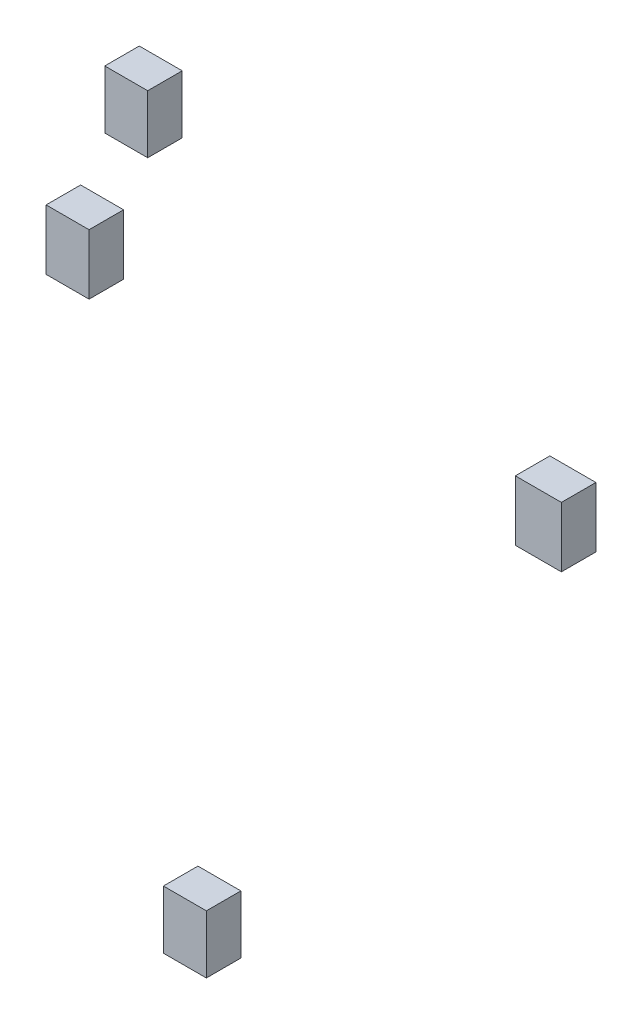
ISO-10303-21;
HEADER;
FILE_DESCRIPTION(('STEP AP214'),'2;1');
FILE_NAME('part.step','',(''),(''),'','','');
FILE_SCHEMA(('AUTOMOTIVE_DESIGN { 1 0 10303 214 1 1 1 1 }'));
ENDSEC;
DATA;
#1=APPLICATION_CONTEXT('core data for automotive mechanical design processes');
#2=APPLICATION_PROTOCOL_DEFINITION('international standard','automotive_design',2000,#1);
#3=PRODUCT_CONTEXT('',#1,'mechanical');
#4=PRODUCT('Part','Part','',(#3));
#5=PRODUCT_RELATED_PRODUCT_CATEGORY('part','',(#4));
#6=PRODUCT_DEFINITION_FORMATION('','',#4);
#7=PRODUCT_DEFINITION_CONTEXT('part definition',#1,'design');
#8=PRODUCT_DEFINITION('design','',#6,#7);
#9=PRODUCT_DEFINITION_SHAPE('','',#8);
#10=(LENGTH_UNIT() NAMED_UNIT(*) SI_UNIT(.MILLI.,.METRE.));
#11=(NAMED_UNIT(*) PLANE_ANGLE_UNIT() SI_UNIT($,.RADIAN.));
#12=(NAMED_UNIT(*) SI_UNIT($,.STERADIAN.) SOLID_ANGLE_UNIT());
#13=UNCERTAINTY_MEASURE_WITH_UNIT(LENGTH_MEASURE(1.E-05),#10,'distance_accuracy_value','');
#14=(GEOMETRIC_REPRESENTATION_CONTEXT(3) GLOBAL_UNCERTAINTY_ASSIGNED_CONTEXT((#13)) GLOBAL_UNIT_ASSIGNED_CONTEXT((#10,
#11,#12)) REPRESENTATION_CONTEXT('',''));
#15=CARTESIAN_POINT('',(0.,0.,0.));
#16=DIRECTION('',(0.,0.,1.));
#17=DIRECTION('',(1.,0.,0.));
#18=AXIS2_PLACEMENT_3D('',#15,#16,#17);
#19=CARTESIAN_POINT('',(-4.50549999999963,-65.4,7.25));
#20=DIRECTION('',(1.,0.,0.));
#21=DIRECTION('',(0.,1.,0.));
#22=AXIS2_PLACEMENT_3D('',#19,#20,#21);
#23=PLANE('',#22);
#24=DIRECTION('',(0.,-1.,0.));
#25=VECTOR('',#24,1.);
#26=CARTESIAN_POINT('',(-4.50549999999963,-65.4,0.));
#27=LINE('',#26,#25);
#28=CARTESIAN_POINT('',(-4.50549999999963,-65.4,0.));
#29=VERTEX_POINT('',#28);
#30=CARTESIAN_POINT('',(-4.50549999999963,-77.6214301256037,0.));
#31=VERTEX_POINT('',#30);
#32=EDGE_CURVE('E139',#29,#31,#27,.T.);
#33=ORIENTED_EDGE('',*,*,#32,.T.);
#34=DIRECTION('',(0.,0.,-1.));
#35=VECTOR('',#34,1.);
#36=CARTESIAN_POINT('',(-4.50549999999963,-77.6214301256037,7.25));
#37=LINE('',#36,#35);
#38=CARTESIAN_POINT('',(-4.50549999999963,-77.6214301256037,7.25));
#39=VERTEX_POINT('',#38);
#40=EDGE_CURVE('E12',#39,#31,#37,.T.);
#41=ORIENTED_EDGE('',*,*,#40,.F.);
#42=DIRECTION('',(0.,-1.,0.));
#43=VECTOR('',#42,1.);
#44=CARTESIAN_POINT('',(-4.50549999999963,-65.4,7.25));
#45=LINE('',#44,#43);
#46=CARTESIAN_POINT('',(-4.50549999999963,-65.4,7.25));
#47=VERTEX_POINT('',#46);
#48=EDGE_CURVE('E159',#47,#39,#45,.T.);
#49=ORIENTED_EDGE('',*,*,#48,.F.);
#50=DIRECTION('',(0.,0.,-1.));
#51=VECTOR('',#50,1.);
#52=CARTESIAN_POINT('',(-4.50549999999963,-65.4,7.25));
#53=LINE('',#52,#51);
#54=EDGE_CURVE('E164',#47,#29,#53,.T.);
#55=ORIENTED_EDGE('',*,*,#54,.T.);
#56=EDGE_LOOP('',(#33,#41,#49,#55));
#57=FACE_BOUND('',#56,.T.);
#58=ADVANCED_FACE('F43',(#57),#23,.F.);
#59=CARTESIAN_POINT('',(-4.50549999999963,-77.6214301256037,7.25));
#60=DIRECTION('',(0.,1.,0.));
#61=DIRECTION('',(0.,0.,1.));
#62=AXIS2_PLACEMENT_3D('',#59,#60,#61);
#63=PLANE('',#62);
#64=DIRECTION('',(1.,0.,0.));
#65=VECTOR('',#64,1.);
#66=CARTESIAN_POINT('',(-4.50549999999963,-77.6214301256037,0.));
#67=LINE('',#66,#65);
#68=CARTESIAN_POINT('',(4.51450000000038,-77.6214301256037,0.));
#69=VERTEX_POINT('',#68);
#70=EDGE_CURVE('E143',#31,#69,#67,.T.);
#71=ORIENTED_EDGE('',*,*,#70,.T.);
#72=DIRECTION('',(0.,0.,-1.));
#73=VECTOR('',#72,1.);
#74=CARTESIAN_POINT('',(4.51450000000038,-77.6214301256037,7.25));
#75=LINE('',#74,#73);
#76=CARTESIAN_POINT('',(4.51450000000038,-77.6214301256037,7.25));
#77=VERTEX_POINT('',#76);
#78=EDGE_CURVE('E50',#77,#69,#75,.T.);
#79=ORIENTED_EDGE('',*,*,#78,.F.);
#80=DIRECTION('',(1.,0.,0.));
#81=VECTOR('',#80,1.);
#82=CARTESIAN_POINT('',(-4.50549999999963,-77.6214301256037,7.25));
#83=LINE('',#82,#81);
#84=EDGE_CURVE('E94',#39,#77,#83,.T.);
#85=ORIENTED_EDGE('',*,*,#84,.F.);
#86=ORIENTED_EDGE('',*,*,#40,.T.);
#87=EDGE_LOOP('',(#71,#79,#85,#86));
#88=FACE_BOUND('',#87,.T.);
#89=ADVANCED_FACE('F193',(#88),#63,.F.);
#90=CARTESIAN_POINT('',(4.51450000000038,-65.4,7.25));
#91=DIRECTION('',(-1.,0.,0.));
#92=DIRECTION('',(0.,-1.,0.));
#93=AXIS2_PLACEMENT_3D('',#90,#91,#92);
#94=PLANE('',#93);
#95=DIRECTION('',(0.,1.,0.));
#96=VECTOR('',#95,1.);
#97=CARTESIAN_POINT('',(4.51450000000038,-65.4,0.));
#98=LINE('',#97,#96);
#99=CARTESIAN_POINT('',(4.51450000000038,-65.4,0.));
#100=VERTEX_POINT('',#99);
#101=EDGE_CURVE('E167',#69,#100,#98,.T.);
#102=ORIENTED_EDGE('',*,*,#101,.T.);
#103=DIRECTION('',(0.,0.,-1.));
#104=VECTOR('',#103,1.);
#105=CARTESIAN_POINT('',(4.51450000000038,-65.4,7.25));
#106=LINE('',#105,#104);
#107=CARTESIAN_POINT('',(4.51450000000038,-65.4,7.25));
#108=VERTEX_POINT('',#107);
#109=EDGE_CURVE('E171',#108,#100,#106,.T.);
#110=ORIENTED_EDGE('',*,*,#109,.F.);
#111=DIRECTION('',(0.,1.,0.));
#112=VECTOR('',#111,1.);
#113=CARTESIAN_POINT('',(4.51450000000038,-65.4,7.25));
#114=LINE('',#113,#112);
#115=EDGE_CURVE('E162',#77,#108,#114,.T.);
#116=ORIENTED_EDGE('',*,*,#115,.F.);
#117=ORIENTED_EDGE('',*,*,#78,.T.);
#118=EDGE_LOOP('',(#102,#110,#116,#117));
#119=FACE_BOUND('',#118,.T.);
#120=ADVANCED_FACE('F176',(#119),#94,.F.);
#121=CARTESIAN_POINT('',(-4.50549999999963,-65.4,7.25));
#122=DIRECTION('',(0.,-1.,0.));
#123=DIRECTION('',(0.,0.,-1.));
#124=AXIS2_PLACEMENT_3D('',#121,#122,#123);
#125=PLANE('',#124);
#126=DIRECTION('',(-1.,0.,0.));
#127=VECTOR('',#126,1.);
#128=CARTESIAN_POINT('',(-4.50549999999963,-65.4,0.));
#129=LINE('',#128,#127);
#130=EDGE_CURVE('E87',#100,#29,#129,.T.);
#131=ORIENTED_EDGE('',*,*,#130,.T.);
#132=ORIENTED_EDGE('',*,*,#54,.F.);
#133=DIRECTION('',(-1.,0.,0.));
#134=VECTOR('',#133,1.);
#135=CARTESIAN_POINT('',(-4.50549999999963,-65.4,7.25));
#136=LINE('',#135,#134);
#137=EDGE_CURVE('E66',#108,#47,#136,.T.);
#138=ORIENTED_EDGE('',*,*,#137,.F.);
#139=ORIENTED_EDGE('',*,*,#109,.T.);
#140=EDGE_LOOP('',(#131,#132,#138,#139));
#141=FACE_BOUND('',#140,.T.);
#142=ADVANCED_FACE('F184',(#141),#125,.F.);
#143=CARTESIAN_POINT('',(0.,0.,7.25));
#144=DIRECTION('',(0.,0.,1.));
#145=DIRECTION('',(1.,0.,0.));
#146=AXIS2_PLACEMENT_3D('',#143,#144,#145);
#147=PLANE('',#146);
#148=ORIENTED_EDGE('',*,*,#48,.T.);
#149=ORIENTED_EDGE('',*,*,#84,.T.);
#150=ORIENTED_EDGE('',*,*,#115,.T.);
#151=ORIENTED_EDGE('',*,*,#137,.T.);
#152=EDGE_LOOP('',(#148,#149,#150,#151));
#153=FACE_BOUND('',#152,.T.);
#154=ADVANCED_FACE('F186',(#153),#147,.T.);
#155=CARTESIAN_POINT('',(0.,0.,0.));
#156=DIRECTION('',(0.,0.,1.));
#157=DIRECTION('',(1.,0.,0.));
#158=AXIS2_PLACEMENT_3D('',#155,#156,#157);
#159=PLANE('',#158);
#160=DIRECTION('',(-1.,0.,0.));
#161=VECTOR('',#160,1.);
#162=CARTESIAN_POINT('',(-4.50549999999963,-65.9,0.));
#163=LINE('',#162,#161);
#164=CARTESIAN_POINT('',(4.01450000000038,-65.9,0.));
#165=VERTEX_POINT('',#164);
#166=CARTESIAN_POINT('',(-4.00549999999963,-65.9,0.));
#167=VERTEX_POINT('',#166);
#168=EDGE_CURVE('E134',#165,#167,#163,.T.);
#169=ORIENTED_EDGE('',*,*,#168,.T.);
#170=DIRECTION('',(0.,-1.,0.));
#171=VECTOR('',#170,1.);
#172=CARTESIAN_POINT('',(-4.00549999999963,-65.4,0.));
#173=LINE('',#172,#171);
#174=CARTESIAN_POINT('',(-4.00549999999963,-77.1214301256037,0.));
#175=VERTEX_POINT('',#174);
#176=EDGE_CURVE('E153',#167,#175,#173,.T.);
#177=ORIENTED_EDGE('',*,*,#176,.T.);
#178=DIRECTION('',(1.,0.,0.));
#179=VECTOR('',#178,1.);
#180=CARTESIAN_POINT('',(-4.50549999999963,-77.1214301256037,0.));
#181=LINE('',#180,#179);
#182=CARTESIAN_POINT('',(4.01450000000038,-77.1214301256037,0.));
#183=VERTEX_POINT('',#182);
#184=EDGE_CURVE('E138',#175,#183,#181,.T.);
#185=ORIENTED_EDGE('',*,*,#184,.T.);
#186=DIRECTION('',(0.,1.,0.));
#187=VECTOR('',#186,1.);
#188=CARTESIAN_POINT('',(4.01450000000038,-65.4,0.));
#189=LINE('',#188,#187);
#190=EDGE_CURVE('E57',#183,#165,#189,.T.);
#191=ORIENTED_EDGE('',*,*,#190,.T.);
#192=EDGE_LOOP('',(#169,#177,#185,#191));
#193=FACE_BOUND('',#192,.T.);
#194=ORIENTED_EDGE('',*,*,#32,.F.);
#195=ORIENTED_EDGE('',*,*,#130,.F.);
#196=ORIENTED_EDGE('',*,*,#101,.F.);
#197=ORIENTED_EDGE('',*,*,#70,.F.);
#198=EDGE_LOOP('',(#194,#195,#196,#197));
#199=FACE_BOUND('',#198,.T.);
#200=ADVANCED_FACE('F180',(#193,#199),#159,.F.);
#201=CARTESIAN_POINT('',(-4.00549999999963,-65.4,7.25));
#202=DIRECTION('',(1.,0.,0.));
#203=DIRECTION('',(0.,1.,0.));
#204=AXIS2_PLACEMENT_3D('',#201,#202,#203);
#205=PLANE('',#204);
#206=ORIENTED_EDGE('',*,*,#176,.F.);
#207=DIRECTION('',(0.,0.,-1.));
#208=VECTOR('',#207,1.);
#209=CARTESIAN_POINT('',(-4.00549999999963,-65.9,7.25));
#210=LINE('',#209,#208);
#211=CARTESIAN_POINT('',(-4.00549999999963,-65.9,7.05));
#212=VERTEX_POINT('',#211);
#213=EDGE_CURVE('E133',#212,#167,#210,.T.);
#214=ORIENTED_EDGE('',*,*,#213,.F.);
#215=DIRECTION('',(0.,-1.,0.));
#216=VECTOR('',#215,1.);
#217=CARTESIAN_POINT('',(-4.00549999999963,-65.4,7.05));
#218=LINE('',#217,#216);
#219=CARTESIAN_POINT('',(-4.00549999999963,-77.1214301256037,7.05));
#220=VERTEX_POINT('',#219);
#221=EDGE_CURVE('E121',#212,#220,#218,.T.);
#222=ORIENTED_EDGE('',*,*,#221,.T.);
#223=DIRECTION('',(0.,0.,-1.));
#224=VECTOR('',#223,1.);
#225=CARTESIAN_POINT('',(-4.00549999999963,-77.1214301256037,7.25));
#226=LINE('',#225,#224);
#227=EDGE_CURVE('E131',#220,#175,#226,.T.);
#228=ORIENTED_EDGE('',*,*,#227,.T.);
#229=EDGE_LOOP('',(#206,#214,#222,#228));
#230=FACE_BOUND('',#229,.T.);
#231=ADVANCED_FACE('F130',(#230),#205,.T.);
#232=CARTESIAN_POINT('',(-4.50549999999963,-77.1214301256037,7.25));
#233=DIRECTION('',(0.,1.,0.));
#234=DIRECTION('',(0.,0.,1.));
#235=AXIS2_PLACEMENT_3D('',#232,#233,#234);
#236=PLANE('',#235);
#237=ORIENTED_EDGE('',*,*,#184,.F.);
#238=ORIENTED_EDGE('',*,*,#227,.F.);
#239=DIRECTION('',(1.,0.,0.));
#240=VECTOR('',#239,1.);
#241=CARTESIAN_POINT('',(-4.50549999999963,-77.1214301256037,7.05));
#242=LINE('',#241,#240);
#243=CARTESIAN_POINT('',(4.01450000000038,-77.1214301256037,7.05));
#244=VERTEX_POINT('',#243);
#245=EDGE_CURVE('E117',#220,#244,#242,.T.);
#246=ORIENTED_EDGE('',*,*,#245,.T.);
#247=DIRECTION('',(0.,0.,-1.));
#248=VECTOR('',#247,1.);
#249=CARTESIAN_POINT('',(4.01450000000038,-77.1214301256037,7.25));
#250=LINE('',#249,#248);
#251=EDGE_CURVE('E140',#244,#183,#250,.T.);
#252=ORIENTED_EDGE('',*,*,#251,.T.);
#253=EDGE_LOOP('',(#237,#238,#246,#252));
#254=FACE_BOUND('',#253,.T.);
#255=ADVANCED_FACE('F136',(#254),#236,.T.);
#256=CARTESIAN_POINT('',(4.01450000000038,-65.4,7.25));
#257=DIRECTION('',(-1.,0.,0.));
#258=DIRECTION('',(0.,-1.,0.));
#259=AXIS2_PLACEMENT_3D('',#256,#257,#258);
#260=PLANE('',#259);
#261=ORIENTED_EDGE('',*,*,#190,.F.);
#262=ORIENTED_EDGE('',*,*,#251,.F.);
#263=DIRECTION('',(0.,1.,0.));
#264=VECTOR('',#263,1.);
#265=CARTESIAN_POINT('',(4.01450000000038,-65.4,7.05));
#266=LINE('',#265,#264);
#267=CARTESIAN_POINT('',(4.01450000000038,-65.9,7.05));
#268=VERTEX_POINT('',#267);
#269=EDGE_CURVE('E122',#244,#268,#266,.T.);
#270=ORIENTED_EDGE('',*,*,#269,.T.);
#271=DIRECTION('',(0.,0.,-1.));
#272=VECTOR('',#271,1.);
#273=CARTESIAN_POINT('',(4.01450000000037,-65.9,7.25));
#274=LINE('',#273,#272);
#275=EDGE_CURVE('E145',#268,#165,#274,.T.);
#276=ORIENTED_EDGE('',*,*,#275,.T.);
#277=EDGE_LOOP('',(#261,#262,#270,#276));
#278=FACE_BOUND('',#277,.T.);
#279=ADVANCED_FACE('F241',(#278),#260,.T.);
#280=CARTESIAN_POINT('',(-4.50549999999963,-65.9,7.25));
#281=DIRECTION('',(0.,-1.,0.));
#282=DIRECTION('',(0.,0.,-1.));
#283=AXIS2_PLACEMENT_3D('',#280,#281,#282);
#284=PLANE('',#283);
#285=ORIENTED_EDGE('',*,*,#168,.F.);
#286=ORIENTED_EDGE('',*,*,#275,.F.);
#287=DIRECTION('',(-1.,0.,0.));
#288=VECTOR('',#287,1.);
#289=CARTESIAN_POINT('',(-4.50549999999963,-65.9,7.05));
#290=LINE('',#289,#288);
#291=EDGE_CURVE('E148',#268,#212,#290,.T.);
#292=ORIENTED_EDGE('',*,*,#291,.T.);
#293=ORIENTED_EDGE('',*,*,#213,.T.);
#294=EDGE_LOOP('',(#285,#286,#292,#293));
#295=FACE_BOUND('',#294,.T.);
#296=ADVANCED_FACE('F250',(#295),#284,.T.);
#297=CARTESIAN_POINT('',(0.,0.,7.05));
#298=DIRECTION('',(0.,0.,1.));
#299=DIRECTION('',(1.,0.,0.));
#300=AXIS2_PLACEMENT_3D('',#297,#298,#299);
#301=PLANE('',#300);
#302=ORIENTED_EDGE('',*,*,#221,.F.);
#303=ORIENTED_EDGE('',*,*,#291,.F.);
#304=ORIENTED_EDGE('',*,*,#269,.F.);
#305=ORIENTED_EDGE('',*,*,#245,.F.);
#306=EDGE_LOOP('',(#302,#303,#304,#305));
#307=FACE_BOUND('',#306,.T.);
#308=ADVANCED_FACE('F119',(#307),#301,.F.);
#309=CLOSED_SHELL('',(#58,#89,#120,#142,#154,#200,#231,#255,#279,#296,#308));
#310=MANIFOLD_SOLID_BREP('B2',#309);
#311=CARTESIAN_POINT('',(69.4145000000004,46.18,7.25));
#312=DIRECTION('',(1.,0.,0.));
#313=DIRECTION('',(0.,0.,-1.));
#314=AXIS2_PLACEMENT_3D('',#311,#312,#313);
#315=PLANE('',#314);
#316=DIRECTION('',(0.,-1.,0.));
#317=VECTOR('',#316,1.);
#318=CARTESIAN_POINT('',(69.4145000000004,46.18,0.));
#319=LINE('',#318,#317);
#320=CARTESIAN_POINT('',(69.4145000000004,46.18,0.));
#321=VERTEX_POINT('',#320);
#322=CARTESIAN_POINT('',(69.4145000000004,33.54,0.));
#323=VERTEX_POINT('',#322);
#324=EDGE_CURVE('E387',#321,#323,#319,.T.);
#325=ORIENTED_EDGE('',*,*,#324,.T.);
#326=DIRECTION('',(0.,0.,-1.));
#327=VECTOR('',#326,1.);
#328=CARTESIAN_POINT('',(69.4145000000004,33.54,7.25));
#329=LINE('',#328,#327);
#330=CARTESIAN_POINT('',(69.4145000000004,33.54,7.25));
#331=VERTEX_POINT('',#330);
#332=EDGE_CURVE('E41',#331,#323,#329,.T.);
#333=ORIENTED_EDGE('',*,*,#332,.F.);
#334=DIRECTION('',(0.,-1.,0.));
#335=VECTOR('',#334,1.);
#336=CARTESIAN_POINT('',(69.4145000000004,46.18,7.25));
#337=LINE('',#336,#335);
#338=CARTESIAN_POINT('',(69.4145000000004,46.18,7.25));
#339=VERTEX_POINT('',#338);
#340=EDGE_CURVE('E407',#339,#331,#337,.T.);
#341=ORIENTED_EDGE('',*,*,#340,.F.);
#342=DIRECTION('',(0.,0.,-1.));
#343=VECTOR('',#342,1.);
#344=CARTESIAN_POINT('',(69.4145000000004,46.18,7.25));
#345=LINE('',#344,#343);
#346=EDGE_CURVE('E412',#339,#321,#345,.T.);
#347=ORIENTED_EDGE('',*,*,#346,.T.);
#348=EDGE_LOOP('',(#325,#333,#341,#347));
#349=FACE_BOUND('',#348,.T.);
#350=ADVANCED_FACE('F291',(#349),#315,.F.);
#351=CARTESIAN_POINT('',(69.4145000000004,33.54,7.25));
#352=DIRECTION('',(0.,1.,0.));
#353=DIRECTION('',(0.,0.,1.));
#354=AXIS2_PLACEMENT_3D('',#351,#352,#353);
#355=PLANE('',#354);
#356=DIRECTION('',(1.,0.,0.));
#357=VECTOR('',#356,1.);
#358=CARTESIAN_POINT('',(69.4145000000004,33.54,0.));
#359=LINE('',#358,#357);
#360=CARTESIAN_POINT('',(79.0868014902547,33.54,0.));
#361=VERTEX_POINT('',#360);
#362=EDGE_CURVE('E391',#323,#361,#359,.T.);
#363=ORIENTED_EDGE('',*,*,#362,.T.);
#364=DIRECTION('',(0.,0.,-1.));
#365=VECTOR('',#364,1.);
#366=CARTESIAN_POINT('',(79.0868014902547,33.54,7.25));
#367=LINE('',#366,#365);
#368=CARTESIAN_POINT('',(79.0868014902547,33.54,7.25));
#369=VERTEX_POINT('',#368);
#370=EDGE_CURVE('E298',#369,#361,#367,.T.);
#371=ORIENTED_EDGE('',*,*,#370,.F.);
#372=DIRECTION('',(1.,0.,0.));
#373=VECTOR('',#372,1.);
#374=CARTESIAN_POINT('',(69.4145000000004,33.54,7.25));
#375=LINE('',#374,#373);
#376=EDGE_CURVE('E342',#331,#369,#375,.T.);
#377=ORIENTED_EDGE('',*,*,#376,.F.);
#378=ORIENTED_EDGE('',*,*,#332,.T.);
#379=EDGE_LOOP('',(#363,#371,#377,#378));
#380=FACE_BOUND('',#379,.T.);
#381=ADVANCED_FACE('F441',(#380),#355,.F.);
#382=CARTESIAN_POINT('',(79.0868014902547,46.18,7.25));
#383=DIRECTION('',(-1.,0.,0.));
#384=DIRECTION('',(0.,0.,1.));
#385=AXIS2_PLACEMENT_3D('',#382,#383,#384);
#386=PLANE('',#385);
#387=DIRECTION('',(0.,1.,0.));
#388=VECTOR('',#387,1.);
#389=CARTESIAN_POINT('',(79.0868014902547,46.18,0.));
#390=LINE('',#389,#388);
#391=CARTESIAN_POINT('',(79.0868014902547,46.18,0.));
#392=VERTEX_POINT('',#391);
#393=EDGE_CURVE('E415',#361,#392,#390,.T.);
#394=ORIENTED_EDGE('',*,*,#393,.T.);
#395=DIRECTION('',(0.,0.,-1.));
#396=VECTOR('',#395,1.);
#397=CARTESIAN_POINT('',(79.0868014902547,46.18,7.25));
#398=LINE('',#397,#396);
#399=CARTESIAN_POINT('',(79.0868014902547,46.18,7.25));
#400=VERTEX_POINT('',#399);
#401=EDGE_CURVE('E419',#400,#392,#398,.T.);
#402=ORIENTED_EDGE('',*,*,#401,.F.);
#403=DIRECTION('',(0.,1.,0.));
#404=VECTOR('',#403,1.);
#405=CARTESIAN_POINT('',(79.0868014902547,46.18,7.25));
#406=LINE('',#405,#404);
#407=EDGE_CURVE('E410',#369,#400,#406,.T.);
#408=ORIENTED_EDGE('',*,*,#407,.F.);
#409=ORIENTED_EDGE('',*,*,#370,.T.);
#410=EDGE_LOOP('',(#394,#402,#408,#409));
#411=FACE_BOUND('',#410,.T.);
#412=ADVANCED_FACE('F424',(#411),#386,.F.);
#413=CARTESIAN_POINT('',(69.4145000000004,46.18,7.25));
#414=DIRECTION('',(0.,-1.,0.));
#415=DIRECTION('',(0.,0.,-1.));
#416=AXIS2_PLACEMENT_3D('',#413,#414,#415);
#417=PLANE('',#416);
#418=DIRECTION('',(-1.,0.,0.));
#419=VECTOR('',#418,1.);
#420=CARTESIAN_POINT('',(69.4145000000004,46.18,0.));
#421=LINE('',#420,#419);
#422=EDGE_CURVE('E335',#392,#321,#421,.T.);
#423=ORIENTED_EDGE('',*,*,#422,.T.);
#424=ORIENTED_EDGE('',*,*,#346,.F.);
#425=DIRECTION('',(-1.,0.,0.));
#426=VECTOR('',#425,1.);
#427=CARTESIAN_POINT('',(69.4145000000004,46.18,7.25));
#428=LINE('',#427,#426);
#429=EDGE_CURVE('E314',#400,#339,#428,.T.);
#430=ORIENTED_EDGE('',*,*,#429,.F.);
#431=ORIENTED_EDGE('',*,*,#401,.T.);
#432=EDGE_LOOP('',(#423,#424,#430,#431));
#433=FACE_BOUND('',#432,.T.);
#434=ADVANCED_FACE('F432',(#433),#417,.F.);
#435=CARTESIAN_POINT('',(0.,0.,7.25));
#436=DIRECTION('',(0.,0.,1.));
#437=DIRECTION('',(1.,0.,0.));
#438=AXIS2_PLACEMENT_3D('',#435,#436,#437);
#439=PLANE('',#438);
#440=ORIENTED_EDGE('',*,*,#340,.T.);
#441=ORIENTED_EDGE('',*,*,#376,.T.);
#442=ORIENTED_EDGE('',*,*,#407,.T.);
#443=ORIENTED_EDGE('',*,*,#429,.T.);
#444=EDGE_LOOP('',(#440,#441,#442,#443));
#445=FACE_BOUND('',#444,.T.);
#446=ADVANCED_FACE('F434',(#445),#439,.T.);
#447=CARTESIAN_POINT('',(0.,0.,0.));
#448=DIRECTION('',(0.,0.,1.));
#449=DIRECTION('',(1.,0.,0.));
#450=AXIS2_PLACEMENT_3D('',#447,#448,#449);
#451=PLANE('',#450);
#452=DIRECTION('',(-1.,0.,0.));
#453=VECTOR('',#452,1.);
#454=CARTESIAN_POINT('',(69.4145000000004,45.68,0.));
#455=LINE('',#454,#453);
#456=CARTESIAN_POINT('',(78.5868014902547,45.68,0.));
#457=VERTEX_POINT('',#456);
#458=CARTESIAN_POINT('',(69.9145000000004,45.68,0.));
#459=VERTEX_POINT('',#458);
#460=EDGE_CURVE('E382',#457,#459,#455,.T.);
#461=ORIENTED_EDGE('',*,*,#460,.T.);
#462=DIRECTION('',(0.,-1.,0.));
#463=VECTOR('',#462,1.);
#464=CARTESIAN_POINT('',(69.9145000000004,46.18,0.));
#465=LINE('',#464,#463);
#466=CARTESIAN_POINT('',(69.9145000000004,34.04,0.));
#467=VERTEX_POINT('',#466);
#468=EDGE_CURVE('E401',#459,#467,#465,.T.);
#469=ORIENTED_EDGE('',*,*,#468,.T.);
#470=DIRECTION('',(1.,0.,0.));
#471=VECTOR('',#470,1.);
#472=CARTESIAN_POINT('',(69.4145000000004,34.04,0.));
#473=LINE('',#472,#471);
#474=CARTESIAN_POINT('',(78.5868014902547,34.04,0.));
#475=VERTEX_POINT('',#474);
#476=EDGE_CURVE('E386',#467,#475,#473,.T.);
#477=ORIENTED_EDGE('',*,*,#476,.T.);
#478=DIRECTION('',(0.,1.,0.));
#479=VECTOR('',#478,1.);
#480=CARTESIAN_POINT('',(78.5868014902547,46.18,0.));
#481=LINE('',#480,#479);
#482=EDGE_CURVE('E305',#475,#457,#481,.T.);
#483=ORIENTED_EDGE('',*,*,#482,.T.);
#484=EDGE_LOOP('',(#461,#469,#477,#483));
#485=FACE_BOUND('',#484,.T.);
#486=ORIENTED_EDGE('',*,*,#324,.F.);
#487=ORIENTED_EDGE('',*,*,#422,.F.);
#488=ORIENTED_EDGE('',*,*,#393,.F.);
#489=ORIENTED_EDGE('',*,*,#362,.F.);
#490=EDGE_LOOP('',(#486,#487,#488,#489));
#491=FACE_BOUND('',#490,.T.);
#492=ADVANCED_FACE('F428',(#485,#491),#451,.F.);
#493=CARTESIAN_POINT('',(69.9145000000004,46.18,7.25));
#494=DIRECTION('',(1.,0.,0.));
#495=DIRECTION('',(0.,0.,-1.));
#496=AXIS2_PLACEMENT_3D('',#493,#494,#495);
#497=PLANE('',#496);
#498=ORIENTED_EDGE('',*,*,#468,.F.);
#499=DIRECTION('',(0.,0.,-1.));
#500=VECTOR('',#499,1.);
#501=CARTESIAN_POINT('',(69.9145000000004,45.68,7.25));
#502=LINE('',#501,#500);
#503=CARTESIAN_POINT('',(69.9145000000004,45.68,7.05));
#504=VERTEX_POINT('',#503);
#505=EDGE_CURVE('E381',#504,#459,#502,.T.);
#506=ORIENTED_EDGE('',*,*,#505,.F.);
#507=DIRECTION('',(0.,-1.,0.));
#508=VECTOR('',#507,1.);
#509=CARTESIAN_POINT('',(69.9145000000004,46.18,7.05));
#510=LINE('',#509,#508);
#511=CARTESIAN_POINT('',(69.9145000000004,34.04,7.05));
#512=VERTEX_POINT('',#511);
#513=EDGE_CURVE('E369',#504,#512,#510,.T.);
#514=ORIENTED_EDGE('',*,*,#513,.T.);
#515=DIRECTION('',(0.,0.,-1.));
#516=VECTOR('',#515,1.);
#517=CARTESIAN_POINT('',(69.9145000000004,34.04,7.25));
#518=LINE('',#517,#516);
#519=EDGE_CURVE('E379',#512,#467,#518,.T.);
#520=ORIENTED_EDGE('',*,*,#519,.T.);
#521=EDGE_LOOP('',(#498,#506,#514,#520));
#522=FACE_BOUND('',#521,.T.);
#523=ADVANCED_FACE('F378',(#522),#497,.T.);
#524=CARTESIAN_POINT('',(69.4145000000004,34.04,7.25));
#525=DIRECTION('',(0.,1.,0.));
#526=DIRECTION('',(0.,0.,1.));
#527=AXIS2_PLACEMENT_3D('',#524,#525,#526);
#528=PLANE('',#527);
#529=ORIENTED_EDGE('',*,*,#476,.F.);
#530=ORIENTED_EDGE('',*,*,#519,.F.);
#531=DIRECTION('',(1.,0.,0.));
#532=VECTOR('',#531,1.);
#533=CARTESIAN_POINT('',(69.4145000000004,34.04,7.05));
#534=LINE('',#533,#532);
#535=CARTESIAN_POINT('',(78.5868014902547,34.04,7.05));
#536=VERTEX_POINT('',#535);
#537=EDGE_CURVE('E365',#512,#536,#534,.T.);
#538=ORIENTED_EDGE('',*,*,#537,.T.);
#539=DIRECTION('',(0.,0.,-1.));
#540=VECTOR('',#539,1.);
#541=CARTESIAN_POINT('',(78.5868014902547,34.04,7.25));
#542=LINE('',#541,#540);
#543=EDGE_CURVE('E388',#536,#475,#542,.T.);
#544=ORIENTED_EDGE('',*,*,#543,.T.);
#545=EDGE_LOOP('',(#529,#530,#538,#544));
#546=FACE_BOUND('',#545,.T.);
#547=ADVANCED_FACE('F384',(#546),#528,.T.);
#548=CARTESIAN_POINT('',(78.5868014902547,46.18,7.25));
#549=DIRECTION('',(-1.,0.,0.));
#550=DIRECTION('',(0.,0.,1.));
#551=AXIS2_PLACEMENT_3D('',#548,#549,#550);
#552=PLANE('',#551);
#553=ORIENTED_EDGE('',*,*,#482,.F.);
#554=ORIENTED_EDGE('',*,*,#543,.F.);
#555=DIRECTION('',(0.,1.,0.));
#556=VECTOR('',#555,1.);
#557=CARTESIAN_POINT('',(78.5868014902547,46.18,7.05));
#558=LINE('',#557,#556);
#559=CARTESIAN_POINT('',(78.5868014902547,45.68,7.05));
#560=VERTEX_POINT('',#559);
#561=EDGE_CURVE('E370',#536,#560,#558,.T.);
#562=ORIENTED_EDGE('',*,*,#561,.T.);
#563=DIRECTION('',(0.,0.,-1.));
#564=VECTOR('',#563,1.);
#565=CARTESIAN_POINT('',(78.5868014902547,45.68,7.25));
#566=LINE('',#565,#564);
#567=EDGE_CURVE('E393',#560,#457,#566,.T.);
#568=ORIENTED_EDGE('',*,*,#567,.T.);
#569=EDGE_LOOP('',(#553,#554,#562,#568));
#570=FACE_BOUND('',#569,.T.);
#571=ADVANCED_FACE('F489',(#570),#552,.T.);
#572=CARTESIAN_POINT('',(69.4145000000004,45.68,7.25));
#573=DIRECTION('',(0.,-1.,0.));
#574=DIRECTION('',(0.,0.,-1.));
#575=AXIS2_PLACEMENT_3D('',#572,#573,#574);
#576=PLANE('',#575);
#577=ORIENTED_EDGE('',*,*,#460,.F.);
#578=ORIENTED_EDGE('',*,*,#567,.F.);
#579=DIRECTION('',(-1.,0.,0.));
#580=VECTOR('',#579,1.);
#581=CARTESIAN_POINT('',(69.4145000000004,45.68,7.05));
#582=LINE('',#581,#580);
#583=EDGE_CURVE('E396',#560,#504,#582,.T.);
#584=ORIENTED_EDGE('',*,*,#583,.T.);
#585=ORIENTED_EDGE('',*,*,#505,.T.);
#586=EDGE_LOOP('',(#577,#578,#584,#585));
#587=FACE_BOUND('',#586,.T.);
#588=ADVANCED_FACE('F498',(#587),#576,.T.);
#589=CARTESIAN_POINT('',(0.,0.,7.05));
#590=DIRECTION('',(0.,0.,1.));
#591=DIRECTION('',(1.,0.,0.));
#592=AXIS2_PLACEMENT_3D('',#589,#590,#591);
#593=PLANE('',#592);
#594=ORIENTED_EDGE('',*,*,#513,.F.);
#595=ORIENTED_EDGE('',*,*,#583,.F.);
#596=ORIENTED_EDGE('',*,*,#561,.F.);
#597=ORIENTED_EDGE('',*,*,#537,.F.);
#598=EDGE_LOOP('',(#594,#595,#596,#597));
#599=FACE_BOUND('',#598,.T.);
#600=ADVANCED_FACE('F367',(#599),#593,.F.);
#601=CLOSED_SHELL('',(#350,#381,#412,#434,#446,#492,#523,#547,#571,#588,#600));
#602=MANIFOLD_SOLID_BREP('B6',#601);
#603=CARTESIAN_POINT('',(-29.1454999999996,46.18,7.25));
#604=DIRECTION('',(1.,0.,0.));
#605=DIRECTION('',(0.,0.,-1.));
#606=AXIS2_PLACEMENT_3D('',#603,#604,#605);
#607=PLANE('',#606);
#608=DIRECTION('',(0.,-1.,0.));
#609=VECTOR('',#608,1.);
#610=CARTESIAN_POINT('',(-29.1454999999996,46.18,0.));
#611=LINE('',#610,#609);
#612=CARTESIAN_POINT('',(-29.1454999999996,46.18,0.));
#613=VERTEX_POINT('',#612);
#614=CARTESIAN_POINT('',(-29.1454999999996,33.54,0.));
#615=VERTEX_POINT('',#614);
#616=EDGE_CURVE('E634',#613,#615,#611,.T.);
#617=ORIENTED_EDGE('',*,*,#616,.T.);
#618=DIRECTION('',(0.,0.,-1.));
#619=VECTOR('',#618,1.);
#620=CARTESIAN_POINT('',(-29.1454999999996,33.54,7.25));
#621=LINE('',#620,#619);
#622=CARTESIAN_POINT('',(-29.1454999999996,33.54,7.25));
#623=VERTEX_POINT('',#622);
#624=EDGE_CURVE('E289',#623,#615,#621,.T.);
#625=ORIENTED_EDGE('',*,*,#624,.F.);
#626=DIRECTION('',(0.,-1.,0.));
#627=VECTOR('',#626,1.);
#628=CARTESIAN_POINT('',(-29.1454999999996,46.18,7.25));
#629=LINE('',#628,#627);
#630=CARTESIAN_POINT('',(-29.1454999999996,46.18,7.25));
#631=VERTEX_POINT('',#630);
#632=EDGE_CURVE('E654',#631,#623,#629,.T.);
#633=ORIENTED_EDGE('',*,*,#632,.F.);
#634=DIRECTION('',(0.,0.,-1.));
#635=VECTOR('',#634,1.);
#636=CARTESIAN_POINT('',(-29.1454999999996,46.18,7.25));
#637=LINE('',#636,#635);
#638=EDGE_CURVE('E659',#631,#613,#637,.T.);
#639=ORIENTED_EDGE('',*,*,#638,.T.);
#640=EDGE_LOOP('',(#617,#625,#633,#639));
#641=FACE_BOUND('',#640,.T.);
#642=ADVANCED_FACE('F538',(#641),#607,.F.);
#643=CARTESIAN_POINT('',(-29.1454999999996,33.54,7.25));
#644=DIRECTION('',(0.,1.,0.));
#645=DIRECTION('',(0.,0.,1.));
#646=AXIS2_PLACEMENT_3D('',#643,#644,#645);
#647=PLANE('',#646);
#648=DIRECTION('',(1.,0.,0.));
#649=VECTOR('',#648,1.);
#650=CARTESIAN_POINT('',(-29.1454999999996,33.54,0.));
#651=LINE('',#650,#649);
#652=CARTESIAN_POINT('',(-20.1254999999996,33.54,0.));
#653=VERTEX_POINT('',#652);
#654=EDGE_CURVE('E638',#615,#653,#651,.T.);
#655=ORIENTED_EDGE('',*,*,#654,.T.);
#656=DIRECTION('',(0.,0.,-1.));
#657=VECTOR('',#656,1.);
#658=CARTESIAN_POINT('',(-20.1254999999996,33.54,7.25));
#659=LINE('',#658,#657);
#660=CARTESIAN_POINT('',(-20.1254999999996,33.54,7.25));
#661=VERTEX_POINT('',#660);
#662=EDGE_CURVE('E545',#661,#653,#659,.T.);
#663=ORIENTED_EDGE('',*,*,#662,.F.);
#664=DIRECTION('',(1.,0.,0.));
#665=VECTOR('',#664,1.);
#666=CARTESIAN_POINT('',(-29.1454999999996,33.54,7.25));
#667=LINE('',#666,#665);
#668=EDGE_CURVE('E589',#623,#661,#667,.T.);
#669=ORIENTED_EDGE('',*,*,#668,.F.);
#670=ORIENTED_EDGE('',*,*,#624,.T.);
#671=EDGE_LOOP('',(#655,#663,#669,#670));
#672=FACE_BOUND('',#671,.T.);
#673=ADVANCED_FACE('F688',(#672),#647,.F.);
#674=CARTESIAN_POINT('',(-20.1254999999996,46.18,7.25));
#675=DIRECTION('',(-1.,0.,0.));
#676=DIRECTION('',(0.,-1.,0.));
#677=AXIS2_PLACEMENT_3D('',#674,#675,#676);
#678=PLANE('',#677);
#679=DIRECTION('',(0.,1.,0.));
#680=VECTOR('',#679,1.);
#681=CARTESIAN_POINT('',(-20.1254999999996,46.18,0.));
#682=LINE('',#681,#680);
#683=CARTESIAN_POINT('',(-20.1254999999996,46.18,0.));
#684=VERTEX_POINT('',#683);
#685=EDGE_CURVE('E662',#653,#684,#682,.T.);
#686=ORIENTED_EDGE('',*,*,#685,.T.);
#687=DIRECTION('',(0.,0.,-1.));
#688=VECTOR('',#687,1.);
#689=CARTESIAN_POINT('',(-20.1254999999996,46.18,7.25));
#690=LINE('',#689,#688);
#691=CARTESIAN_POINT('',(-20.1254999999996,46.18,7.25));
#692=VERTEX_POINT('',#691);
#693=EDGE_CURVE('E666',#692,#684,#690,.T.);
#694=ORIENTED_EDGE('',*,*,#693,.F.);
#695=DIRECTION('',(0.,1.,0.));
#696=VECTOR('',#695,1.);
#697=CARTESIAN_POINT('',(-20.1254999999996,46.18,7.25));
#698=LINE('',#697,#696);
#699=EDGE_CURVE('E657',#661,#692,#698,.T.);
#700=ORIENTED_EDGE('',*,*,#699,.F.);
#701=ORIENTED_EDGE('',*,*,#662,.T.);
#702=EDGE_LOOP('',(#686,#694,#700,#701));
#703=FACE_BOUND('',#702,.T.);
#704=ADVANCED_FACE('F671',(#703),#678,.F.);
#705=CARTESIAN_POINT('',(-29.1454999999996,46.18,7.25));
#706=DIRECTION('',(0.,-1.,0.));
#707=DIRECTION('',(0.,0.,-1.));
#708=AXIS2_PLACEMENT_3D('',#705,#706,#707);
#709=PLANE('',#708);
#710=DIRECTION('',(-1.,0.,0.));
#711=VECTOR('',#710,1.);
#712=CARTESIAN_POINT('',(-29.1454999999996,46.18,0.));
#713=LINE('',#712,#711);
#714=EDGE_CURVE('E582',#684,#613,#713,.T.);
#715=ORIENTED_EDGE('',*,*,#714,.T.);
#716=ORIENTED_EDGE('',*,*,#638,.F.);
#717=DIRECTION('',(-1.,0.,0.));
#718=VECTOR('',#717,1.);
#719=CARTESIAN_POINT('',(-29.1454999999996,46.18,7.25));
#720=LINE('',#719,#718);
#721=EDGE_CURVE('E561',#692,#631,#720,.T.);
#722=ORIENTED_EDGE('',*,*,#721,.F.);
#723=ORIENTED_EDGE('',*,*,#693,.T.);
#724=EDGE_LOOP('',(#715,#716,#722,#723));
#725=FACE_BOUND('',#724,.T.);
#726=ADVANCED_FACE('F679',(#725),#709,.F.);
#727=CARTESIAN_POINT('',(0.,0.,7.25));
#728=DIRECTION('',(0.,0.,1.));
#729=DIRECTION('',(1.,0.,0.));
#730=AXIS2_PLACEMENT_3D('',#727,#728,#729);
#731=PLANE('',#730);
#732=ORIENTED_EDGE('',*,*,#632,.T.);
#733=ORIENTED_EDGE('',*,*,#668,.T.);
#734=ORIENTED_EDGE('',*,*,#699,.T.);
#735=ORIENTED_EDGE('',*,*,#721,.T.);
#736=EDGE_LOOP('',(#732,#733,#734,#735));
#737=FACE_BOUND('',#736,.T.);
#738=ADVANCED_FACE('F681',(#737),#731,.T.);
#739=CARTESIAN_POINT('',(0.,0.,0.));
#740=DIRECTION('',(0.,0.,1.));
#741=DIRECTION('',(1.,0.,0.));
#742=AXIS2_PLACEMENT_3D('',#739,#740,#741);
#743=PLANE('',#742);
#744=DIRECTION('',(-1.,0.,0.));
#745=VECTOR('',#744,1.);
#746=CARTESIAN_POINT('',(-29.1454999999996,45.68,0.));
#747=LINE('',#746,#745);
#748=CARTESIAN_POINT('',(-20.6254999999996,45.68,0.));
#749=VERTEX_POINT('',#748);
#750=CARTESIAN_POINT('',(-28.6454999999996,45.68,0.));
#751=VERTEX_POINT('',#750);
#752=EDGE_CURVE('E629',#749,#751,#747,.T.);
#753=ORIENTED_EDGE('',*,*,#752,.T.);
#754=DIRECTION('',(0.,-1.,0.));
#755=VECTOR('',#754,1.);
#756=CARTESIAN_POINT('',(-28.6454999999996,46.18,0.));
#757=LINE('',#756,#755);
#758=CARTESIAN_POINT('',(-28.6454999999996,34.04,0.));
#759=VERTEX_POINT('',#758);
#760=EDGE_CURVE('E648',#751,#759,#757,.T.);
#761=ORIENTED_EDGE('',*,*,#760,.T.);
#762=DIRECTION('',(1.,0.,0.));
#763=VECTOR('',#762,1.);
#764=CARTESIAN_POINT('',(-29.1454999999996,34.04,0.));
#765=LINE('',#764,#763);
#766=CARTESIAN_POINT('',(-20.6254999999996,34.04,0.));
#767=VERTEX_POINT('',#766);
#768=EDGE_CURVE('E633',#759,#767,#765,.T.);
#769=ORIENTED_EDGE('',*,*,#768,.T.);
#770=DIRECTION('',(0.,1.,0.));
#771=VECTOR('',#770,1.);
#772=CARTESIAN_POINT('',(-20.6254999999996,46.18,0.));
#773=LINE('',#772,#771);
#774=EDGE_CURVE('E552',#767,#749,#773,.T.);
#775=ORIENTED_EDGE('',*,*,#774,.T.);
#776=EDGE_LOOP('',(#753,#761,#769,#775));
#777=FACE_BOUND('',#776,.T.);
#778=ORIENTED_EDGE('',*,*,#616,.F.);
#779=ORIENTED_EDGE('',*,*,#714,.F.);
#780=ORIENTED_EDGE('',*,*,#685,.F.);
#781=ORIENTED_EDGE('',*,*,#654,.F.);
#782=EDGE_LOOP('',(#778,#779,#780,#781));
#783=FACE_BOUND('',#782,.T.);
#784=ADVANCED_FACE('F675',(#777,#783),#743,.F.);
#785=CARTESIAN_POINT('',(-28.6454999999996,46.18,7.25));
#786=DIRECTION('',(1.,0.,0.));
#787=DIRECTION('',(0.,0.,-1.));
#788=AXIS2_PLACEMENT_3D('',#785,#786,#787);
#789=PLANE('',#788);
#790=ORIENTED_EDGE('',*,*,#760,.F.);
#791=DIRECTION('',(0.,0.,-1.));
#792=VECTOR('',#791,1.);
#793=CARTESIAN_POINT('',(-28.6454999999996,45.68,7.25));
#794=LINE('',#793,#792);
#795=CARTESIAN_POINT('',(-28.6454999999996,45.68,7.05));
#796=VERTEX_POINT('',#795);
#797=EDGE_CURVE('E628',#796,#751,#794,.T.);
#798=ORIENTED_EDGE('',*,*,#797,.F.);
#799=DIRECTION('',(0.,-1.,0.));
#800=VECTOR('',#799,1.);
#801=CARTESIAN_POINT('',(-28.6454999999996,46.18,7.05));
#802=LINE('',#801,#800);
#803=CARTESIAN_POINT('',(-28.6454999999996,34.04,7.05));
#804=VERTEX_POINT('',#803);
#805=EDGE_CURVE('E616',#796,#804,#802,.T.);
#806=ORIENTED_EDGE('',*,*,#805,.T.);
#807=DIRECTION('',(0.,0.,-1.));
#808=VECTOR('',#807,1.);
#809=CARTESIAN_POINT('',(-28.6454999999996,34.04,7.25));
#810=LINE('',#809,#808);
#811=EDGE_CURVE('E626',#804,#759,#810,.T.);
#812=ORIENTED_EDGE('',*,*,#811,.T.);
#813=EDGE_LOOP('',(#790,#798,#806,#812));
#814=FACE_BOUND('',#813,.T.);
#815=ADVANCED_FACE('F625',(#814),#789,.T.);
#816=CARTESIAN_POINT('',(-29.1454999999996,34.04,7.25));
#817=DIRECTION('',(0.,1.,0.));
#818=DIRECTION('',(0.,0.,1.));
#819=AXIS2_PLACEMENT_3D('',#816,#817,#818);
#820=PLANE('',#819);
#821=ORIENTED_EDGE('',*,*,#768,.F.);
#822=ORIENTED_EDGE('',*,*,#811,.F.);
#823=DIRECTION('',(1.,0.,0.));
#824=VECTOR('',#823,1.);
#825=CARTESIAN_POINT('',(-29.1454999999996,34.04,7.05));
#826=LINE('',#825,#824);
#827=CARTESIAN_POINT('',(-20.6254999999996,34.04,7.05));
#828=VERTEX_POINT('',#827);
#829=EDGE_CURVE('E612',#804,#828,#826,.T.);
#830=ORIENTED_EDGE('',*,*,#829,.T.);
#831=DIRECTION('',(0.,0.,-1.));
#832=VECTOR('',#831,1.);
#833=CARTESIAN_POINT('',(-20.6254999999996,34.04,7.25));
#834=LINE('',#833,#832);
#835=EDGE_CURVE('E635',#828,#767,#834,.T.);
#836=ORIENTED_EDGE('',*,*,#835,.T.);
#837=EDGE_LOOP('',(#821,#822,#830,#836));
#838=FACE_BOUND('',#837,.T.);
#839=ADVANCED_FACE('F631',(#838),#820,.T.);
#840=CARTESIAN_POINT('',(-20.6254999999996,46.18,7.25));
#841=DIRECTION('',(-1.,0.,0.));
#842=DIRECTION('',(0.,-1.,0.));
#843=AXIS2_PLACEMENT_3D('',#840,#841,#842);
#844=PLANE('',#843);
#845=ORIENTED_EDGE('',*,*,#774,.F.);
#846=ORIENTED_EDGE('',*,*,#835,.F.);
#847=DIRECTION('',(0.,1.,0.));
#848=VECTOR('',#847,1.);
#849=CARTESIAN_POINT('',(-20.6254999999996,46.18,7.05));
#850=LINE('',#849,#848);
#851=CARTESIAN_POINT('',(-20.6254999999996,45.68,7.05));
#852=VERTEX_POINT('',#851);
#853=EDGE_CURVE('E617',#828,#852,#850,.T.);
#854=ORIENTED_EDGE('',*,*,#853,.T.);
#855=DIRECTION('',(0.,0.,-1.));
#856=VECTOR('',#855,1.);
#857=CARTESIAN_POINT('',(-20.6254999999996,45.68,7.25));
#858=LINE('',#857,#856);
#859=EDGE_CURVE('E640',#852,#749,#858,.T.);
#860=ORIENTED_EDGE('',*,*,#859,.T.);
#861=EDGE_LOOP('',(#845,#846,#854,#860));
#862=FACE_BOUND('',#861,.T.);
#863=ADVANCED_FACE('F736',(#862),#844,.T.);
#864=CARTESIAN_POINT('',(-29.1454999999996,45.68,7.25));
#865=DIRECTION('',(0.,-1.,0.));
#866=DIRECTION('',(0.,0.,-1.));
#867=AXIS2_PLACEMENT_3D('',#864,#865,#866);
#868=PLANE('',#867);
#869=ORIENTED_EDGE('',*,*,#752,.F.);
#870=ORIENTED_EDGE('',*,*,#859,.F.);
#871=DIRECTION('',(-1.,0.,0.));
#872=VECTOR('',#871,1.);
#873=CARTESIAN_POINT('',(-29.1454999999996,45.68,7.05));
#874=LINE('',#873,#872);
#875=EDGE_CURVE('E643',#852,#796,#874,.T.);
#876=ORIENTED_EDGE('',*,*,#875,.T.);
#877=ORIENTED_EDGE('',*,*,#797,.T.);
#878=EDGE_LOOP('',(#869,#870,#876,#877));
#879=FACE_BOUND('',#878,.T.);
#880=ADVANCED_FACE('F745',(#879),#868,.T.);
#881=CARTESIAN_POINT('',(0.,0.,7.05));
#882=DIRECTION('',(0.,0.,1.));
#883=DIRECTION('',(1.,0.,0.));
#884=AXIS2_PLACEMENT_3D('',#881,#882,#883);
#885=PLANE('',#884);
#886=ORIENTED_EDGE('',*,*,#805,.F.);
#887=ORIENTED_EDGE('',*,*,#875,.F.);
#888=ORIENTED_EDGE('',*,*,#853,.F.);
#889=ORIENTED_EDGE('',*,*,#829,.F.);
#890=EDGE_LOOP('',(#886,#887,#888,#889));
#891=FACE_BOUND('',#890,.T.);
#892=ADVANCED_FACE('F614',(#891),#885,.F.);
#893=CLOSED_SHELL('',(#642,#673,#704,#726,#738,#784,#815,#839,#863,#880,#892));
#894=MANIFOLD_SOLID_BREP('B35',#893);
#895=CARTESIAN_POINT('',(-16.8255,77.6214301256037,7.25));
#896=DIRECTION('',(1.,0.,0.));
#897=DIRECTION('',(0.,0.,-1.));
#898=AXIS2_PLACEMENT_3D('',#895,#896,#897);
#899=PLANE('',#898);
#900=DIRECTION('',(0.,-1.,0.));
#901=VECTOR('',#900,1.);
#902=CARTESIAN_POINT('',(-16.8255,77.6214301256037,0.));
#903=LINE('',#902,#901);
#904=CARTESIAN_POINT('',(-16.8255,77.6214301256037,0.));
#905=VERTEX_POINT('',#904);
#906=CARTESIAN_POINT('',(-16.8255,65.42,0.));
#907=VERTEX_POINT('',#906);
#908=EDGE_CURVE('E872',#905,#907,#903,.T.);
#909=ORIENTED_EDGE('',*,*,#908,.T.);
#910=DIRECTION('',(0.,0.,-1.));
#911=VECTOR('',#910,1.);
#912=CARTESIAN_POINT('',(-16.8255,65.42,7.25));
#913=LINE('',#912,#911);
#914=CARTESIAN_POINT('',(-16.8255,65.42,7.25));
#915=VERTEX_POINT('',#914);
#916=EDGE_CURVE('E536',#915,#907,#913,.T.);
#917=ORIENTED_EDGE('',*,*,#916,.F.);
#918=DIRECTION('',(0.,-1.,0.));
#919=VECTOR('',#918,1.);
#920=CARTESIAN_POINT('',(-16.8255,77.6214301256037,7.25));
#921=LINE('',#920,#919);
#922=CARTESIAN_POINT('',(-16.8255,77.6214301256037,7.25));
#923=VERTEX_POINT('',#922);
#924=EDGE_CURVE('E892',#923,#915,#921,.T.);
#925=ORIENTED_EDGE('',*,*,#924,.F.);
#926=DIRECTION('',(0.,0.,-1.));
#927=VECTOR('',#926,1.);
#928=CARTESIAN_POINT('',(-16.8255,77.6214301256037,7.25));
#929=LINE('',#928,#927);
#930=EDGE_CURVE('E897',#923,#905,#929,.T.);
#931=ORIENTED_EDGE('',*,*,#930,.T.);
#932=EDGE_LOOP('',(#909,#917,#925,#931));
#933=FACE_BOUND('',#932,.T.);
#934=ADVANCED_FACE('F776',(#933),#899,.F.);
#935=CARTESIAN_POINT('',(-16.8255,65.42,7.25));
#936=DIRECTION('',(0.,1.,0.));
#937=DIRECTION('',(0.,0.,1.));
#938=AXIS2_PLACEMENT_3D('',#935,#936,#937);
#939=PLANE('',#938);
#940=DIRECTION('',(1.,0.,0.));
#941=VECTOR('',#940,1.);
#942=CARTESIAN_POINT('',(-16.8255,65.42,0.));
#943=LINE('',#942,#941);
#944=CARTESIAN_POINT('',(-7.80550000000001,65.42,0.));
#945=VERTEX_POINT('',#944);
#946=EDGE_CURVE('E876',#907,#945,#943,.T.);
#947=ORIENTED_EDGE('',*,*,#946,.T.);
#948=DIRECTION('',(0.,0.,-1.));
#949=VECTOR('',#948,1.);
#950=CARTESIAN_POINT('',(-7.80550000000001,65.42,7.25));
#951=LINE('',#950,#949);
#952=CARTESIAN_POINT('',(-7.80550000000001,65.42,7.25));
#953=VERTEX_POINT('',#952);
#954=EDGE_CURVE('E783',#953,#945,#951,.T.);
#955=ORIENTED_EDGE('',*,*,#954,.F.);
#956=DIRECTION('',(1.,0.,0.));
#957=VECTOR('',#956,1.);
#958=CARTESIAN_POINT('',(-16.8255,65.42,7.25));
#959=LINE('',#958,#957);
#960=EDGE_CURVE('E827',#915,#953,#959,.T.);
#961=ORIENTED_EDGE('',*,*,#960,.F.);
#962=ORIENTED_EDGE('',*,*,#916,.T.);
#963=EDGE_LOOP('',(#947,#955,#961,#962));
#964=FACE_BOUND('',#963,.T.);
#965=ADVANCED_FACE('F926',(#964),#939,.F.);
#966=CARTESIAN_POINT('',(-7.80550000000001,77.6214301256037,7.25));
#967=DIRECTION('',(-1.,0.,0.));
#968=DIRECTION('',(0.,0.,1.));
#969=AXIS2_PLACEMENT_3D('',#966,#967,#968);
#970=PLANE('',#969);
#971=DIRECTION('',(0.,1.,0.));
#972=VECTOR('',#971,1.);
#973=CARTESIAN_POINT('',(-7.80550000000001,77.6214301256037,0.));
#974=LINE('',#973,#972);
#975=CARTESIAN_POINT('',(-7.80550000000001,77.6214301256037,0.));
#976=VERTEX_POINT('',#975);
#977=EDGE_CURVE('E900',#945,#976,#974,.T.);
#978=ORIENTED_EDGE('',*,*,#977,.T.);
#979=DIRECTION('',(0.,0.,-1.));
#980=VECTOR('',#979,1.);
#981=CARTESIAN_POINT('',(-7.80550000000001,77.6214301256037,7.25));
#982=LINE('',#981,#980);
#983=CARTESIAN_POINT('',(-7.80550000000001,77.6214301256037,7.25));
#984=VERTEX_POINT('',#983);
#985=EDGE_CURVE('E904',#984,#976,#982,.T.);
#986=ORIENTED_EDGE('',*,*,#985,.F.);
#987=DIRECTION('',(0.,1.,0.));
#988=VECTOR('',#987,1.);
#989=CARTESIAN_POINT('',(-7.80550000000001,77.6214301256037,7.25));
#990=LINE('',#989,#988);
#991=EDGE_CURVE('E895',#953,#984,#990,.T.);
#992=ORIENTED_EDGE('',*,*,#991,.F.);
#993=ORIENTED_EDGE('',*,*,#954,.T.);
#994=EDGE_LOOP('',(#978,#986,#992,#993));
#995=FACE_BOUND('',#994,.T.);
#996=ADVANCED_FACE('F909',(#995),#970,.F.);
#997=CARTESIAN_POINT('',(-16.8255,77.6214301256037,7.25));
#998=DIRECTION('',(0.,-1.,0.));
#999=DIRECTION('',(0.,0.,-1.));
#1000=AXIS2_PLACEMENT_3D('',#997,#998,#999);
#1001=PLANE('',#1000);
#1002=DIRECTION('',(-1.,0.,0.));
#1003=VECTOR('',#1002,1.);
#1004=CARTESIAN_POINT('',(-16.8255,77.6214301256037,0.));
#1005=LINE('',#1004,#1003);
#1006=EDGE_CURVE('E820',#976,#905,#1005,.T.);
#1007=ORIENTED_EDGE('',*,*,#1006,.T.);
#1008=ORIENTED_EDGE('',*,*,#930,.F.);
#1009=DIRECTION('',(-1.,0.,0.));
#1010=VECTOR('',#1009,1.);
#1011=CARTESIAN_POINT('',(-16.8255,77.6214301256037,7.25));
#1012=LINE('',#1011,#1010);
#1013=EDGE_CURVE('E799',#984,#923,#1012,.T.);
#1014=ORIENTED_EDGE('',*,*,#1013,.F.);
#1015=ORIENTED_EDGE('',*,*,#985,.T.);
#1016=EDGE_LOOP('',(#1007,#1008,#1014,#1015));
#1017=FACE_BOUND('',#1016,.T.);
#1018=ADVANCED_FACE('F917',(#1017),#1001,.F.);
#1019=CARTESIAN_POINT('',(0.,0.,7.25));
#1020=DIRECTION('',(0.,0.,1.));
#1021=DIRECTION('',(1.,0.,0.));
#1022=AXIS2_PLACEMENT_3D('',#1019,#1020,#1021);
#1023=PLANE('',#1022);
#1024=ORIENTED_EDGE('',*,*,#924,.T.);
#1025=ORIENTED_EDGE('',*,*,#960,.T.);
#1026=ORIENTED_EDGE('',*,*,#991,.T.);
#1027=ORIENTED_EDGE('',*,*,#1013,.T.);
#1028=EDGE_LOOP('',(#1024,#1025,#1026,#1027));
#1029=FACE_BOUND('',#1028,.T.);
#1030=ADVANCED_FACE('F919',(#1029),#1023,.T.);
#1031=CARTESIAN_POINT('',(0.,0.,0.));
#1032=DIRECTION('',(0.,0.,1.));
#1033=DIRECTION('',(1.,0.,0.));
#1034=AXIS2_PLACEMENT_3D('',#1031,#1032,#1033);
#1035=PLANE('',#1034);
#1036=DIRECTION('',(-1.,0.,0.));
#1037=VECTOR('',#1036,1.);
#1038=CARTESIAN_POINT('',(-16.8255,77.1214301256037,0.));
#1039=LINE('',#1038,#1037);
#1040=CARTESIAN_POINT('',(-8.30550000000001,77.1214301256037,0.));
#1041=VERTEX_POINT('',#1040);
#1042=CARTESIAN_POINT('',(-16.3255,77.1214301256037,0.));
#1043=VERTEX_POINT('',#1042);
#1044=EDGE_CURVE('E867',#1041,#1043,#1039,.T.);
#1045=ORIENTED_EDGE('',*,*,#1044,.T.);
#1046=DIRECTION('',(0.,-1.,0.));
#1047=VECTOR('',#1046,1.);
#1048=CARTESIAN_POINT('',(-16.3255,77.6214301256037,0.));
#1049=LINE('',#1048,#1047);
#1050=CARTESIAN_POINT('',(-16.3255,65.92,0.));
#1051=VERTEX_POINT('',#1050);
#1052=EDGE_CURVE('E886',#1043,#1051,#1049,.T.);
#1053=ORIENTED_EDGE('',*,*,#1052,.T.);
#1054=DIRECTION('',(1.,0.,0.));
#1055=VECTOR('',#1054,1.);
#1056=CARTESIAN_POINT('',(-16.8255,65.92,0.));
#1057=LINE('',#1056,#1055);
#1058=CARTESIAN_POINT('',(-8.30550000000001,65.92,0.));
#1059=VERTEX_POINT('',#1058);
#1060=EDGE_CURVE('E871',#1051,#1059,#1057,.T.);
#1061=ORIENTED_EDGE('',*,*,#1060,.T.);
#1062=DIRECTION('',(0.,1.,0.));
#1063=VECTOR('',#1062,1.);
#1064=CARTESIAN_POINT('',(-8.30550000000001,77.6214301256037,0.));
#1065=LINE('',#1064,#1063);
#1066=EDGE_CURVE('E790',#1059,#1041,#1065,.T.);
#1067=ORIENTED_EDGE('',*,*,#1066,.T.);
#1068=EDGE_LOOP('',(#1045,#1053,#1061,#1067));
#1069=FACE_BOUND('',#1068,.T.);
#1070=ORIENTED_EDGE('',*,*,#908,.F.);
#1071=ORIENTED_EDGE('',*,*,#1006,.F.);
#1072=ORIENTED_EDGE('',*,*,#977,.F.);
#1073=ORIENTED_EDGE('',*,*,#946,.F.);
#1074=EDGE_LOOP('',(#1070,#1071,#1072,#1073));
#1075=FACE_BOUND('',#1074,.T.);
#1076=ADVANCED_FACE('F913',(#1069,#1075),#1035,.F.);
#1077=CARTESIAN_POINT('',(-16.3255,77.6214301256037,7.25));
#1078=DIRECTION('',(1.,0.,0.));
#1079=DIRECTION('',(0.,0.,-1.));
#1080=AXIS2_PLACEMENT_3D('',#1077,#1078,#1079);
#1081=PLANE('',#1080);
#1082=ORIENTED_EDGE('',*,*,#1052,.F.);
#1083=DIRECTION('',(0.,0.,-1.));
#1084=VECTOR('',#1083,1.);
#1085=CARTESIAN_POINT('',(-16.3255,77.1214301256037,7.25));
#1086=LINE('',#1085,#1084);
#1087=CARTESIAN_POINT('',(-16.3255,77.1214301256037,7.05));
#1088=VERTEX_POINT('',#1087);
#1089=EDGE_CURVE('E866',#1088,#1043,#1086,.T.);
#1090=ORIENTED_EDGE('',*,*,#1089,.F.);
#1091=DIRECTION('',(0.,-1.,0.));
#1092=VECTOR('',#1091,1.);
#1093=CARTESIAN_POINT('',(-16.3255,77.6214301256037,7.05));
#1094=LINE('',#1093,#1092);
#1095=CARTESIAN_POINT('',(-16.3255,65.92,7.05));
#1096=VERTEX_POINT('',#1095);
#1097=EDGE_CURVE('E854',#1088,#1096,#1094,.T.);
#1098=ORIENTED_EDGE('',*,*,#1097,.T.);
#1099=DIRECTION('',(0.,0.,-1.));
#1100=VECTOR('',#1099,1.);
#1101=CARTESIAN_POINT('',(-16.3255,65.92,7.25));
#1102=LINE('',#1101,#1100);
#1103=EDGE_CURVE('E864',#1096,#1051,#1102,.T.);
#1104=ORIENTED_EDGE('',*,*,#1103,.T.);
#1105=EDGE_LOOP('',(#1082,#1090,#1098,#1104));
#1106=FACE_BOUND('',#1105,.T.);
#1107=ADVANCED_FACE('F863',(#1106),#1081,.T.);
#1108=CARTESIAN_POINT('',(-16.8255,65.92,7.25));
#1109=DIRECTION('',(0.,1.,0.));
#1110=DIRECTION('',(0.,0.,1.));
#1111=AXIS2_PLACEMENT_3D('',#1108,#1109,#1110);
#1112=PLANE('',#1111);
#1113=ORIENTED_EDGE('',*,*,#1060,.F.);
#1114=ORIENTED_EDGE('',*,*,#1103,.F.);
#1115=DIRECTION('',(1.,0.,0.));
#1116=VECTOR('',#1115,1.);
#1117=CARTESIAN_POINT('',(-16.8255,65.92,7.05));
#1118=LINE('',#1117,#1116);
#1119=CARTESIAN_POINT('',(-8.30550000000001,65.92,7.05));
#1120=VERTEX_POINT('',#1119);
#1121=EDGE_CURVE('E850',#1096,#1120,#1118,.T.);
#1122=ORIENTED_EDGE('',*,*,#1121,.T.);
#1123=DIRECTION('',(0.,0.,-1.));
#1124=VECTOR('',#1123,1.);
#1125=CARTESIAN_POINT('',(-8.30550000000001,65.92,7.25));
#1126=LINE('',#1125,#1124);
#1127=EDGE_CURVE('E873',#1120,#1059,#1126,.T.);
#1128=ORIENTED_EDGE('',*,*,#1127,.T.);
#1129=EDGE_LOOP('',(#1113,#1114,#1122,#1128));
#1130=FACE_BOUND('',#1129,.T.);
#1131=ADVANCED_FACE('F869',(#1130),#1112,.T.);
#1132=CARTESIAN_POINT('',(-8.30550000000001,77.6214301256037,7.25));
#1133=DIRECTION('',(-1.,0.,0.));
#1134=DIRECTION('',(0.,0.,1.));
#1135=AXIS2_PLACEMENT_3D('',#1132,#1133,#1134);
#1136=PLANE('',#1135);
#1137=ORIENTED_EDGE('',*,*,#1066,.F.);
#1138=ORIENTED_EDGE('',*,*,#1127,.F.);
#1139=DIRECTION('',(0.,1.,0.));
#1140=VECTOR('',#1139,1.);
#1141=CARTESIAN_POINT('',(-8.30550000000001,77.6214301256037,7.05));
#1142=LINE('',#1141,#1140);
#1143=CARTESIAN_POINT('',(-8.30550000000001,77.1214301256037,7.05));
#1144=VERTEX_POINT('',#1143);
#1145=EDGE_CURVE('E855',#1120,#1144,#1142,.T.);
#1146=ORIENTED_EDGE('',*,*,#1145,.T.);
#1147=DIRECTION('',(0.,0.,-1.));
#1148=VECTOR('',#1147,1.);
#1149=CARTESIAN_POINT('',(-8.30550000000001,77.1214301256037,7.25));
#1150=LINE('',#1149,#1148);
#1151=EDGE_CURVE('E878',#1144,#1041,#1150,.T.);
#1152=ORIENTED_EDGE('',*,*,#1151,.T.);
#1153=EDGE_LOOP('',(#1137,#1138,#1146,#1152));
#1154=FACE_BOUND('',#1153,.T.);
#1155=ADVANCED_FACE('F974',(#1154),#1136,.T.);
#1156=CARTESIAN_POINT('',(-16.8255,77.1214301256037,7.25));
#1157=DIRECTION('',(0.,-1.,0.));
#1158=DIRECTION('',(0.,0.,-1.));
#1159=AXIS2_PLACEMENT_3D('',#1156,#1157,#1158);
#1160=PLANE('',#1159);
#1161=ORIENTED_EDGE('',*,*,#1044,.F.);
#1162=ORIENTED_EDGE('',*,*,#1151,.F.);
#1163=DIRECTION('',(-1.,0.,0.));
#1164=VECTOR('',#1163,1.);
#1165=CARTESIAN_POINT('',(-16.8255,77.1214301256037,7.05));
#1166=LINE('',#1165,#1164);
#1167=EDGE_CURVE('E881',#1144,#1088,#1166,.T.);
#1168=ORIENTED_EDGE('',*,*,#1167,.T.);
#1169=ORIENTED_EDGE('',*,*,#1089,.T.);
#1170=EDGE_LOOP('',(#1161,#1162,#1168,#1169));
#1171=FACE_BOUND('',#1170,.T.);
#1172=ADVANCED_FACE('F983',(#1171),#1160,.T.);
#1173=CARTESIAN_POINT('',(0.,0.,7.05));
#1174=DIRECTION('',(0.,0.,1.));
#1175=DIRECTION('',(1.,0.,0.));
#1176=AXIS2_PLACEMENT_3D('',#1173,#1174,#1175);
#1177=PLANE('',#1176);
#1178=ORIENTED_EDGE('',*,*,#1097,.F.);
#1179=ORIENTED_EDGE('',*,*,#1167,.F.);
#1180=ORIENTED_EDGE('',*,*,#1145,.F.);
#1181=ORIENTED_EDGE('',*,*,#1121,.F.);
#1182=EDGE_LOOP('',(#1178,#1179,#1180,#1181));
#1183=FACE_BOUND('',#1182,.T.);
#1184=ADVANCED_FACE('F852',(#1183),#1177,.F.);
#1185=CLOSED_SHELL('',(#934,#965,#996,#1018,#1030,#1076,#1107,#1131,#1155,#1172,#1184));
#1186=MANIFOLD_SOLID_BREP('B283',#1185);
#1187=ADVANCED_BREP_SHAPE_REPRESENTATION('',(#18,#310,#602,#894,#1186),#14);
#1188=SHAPE_DEFINITION_REPRESENTATION(#9,#1187);
ENDSEC;
END-ISO-10303-21;
